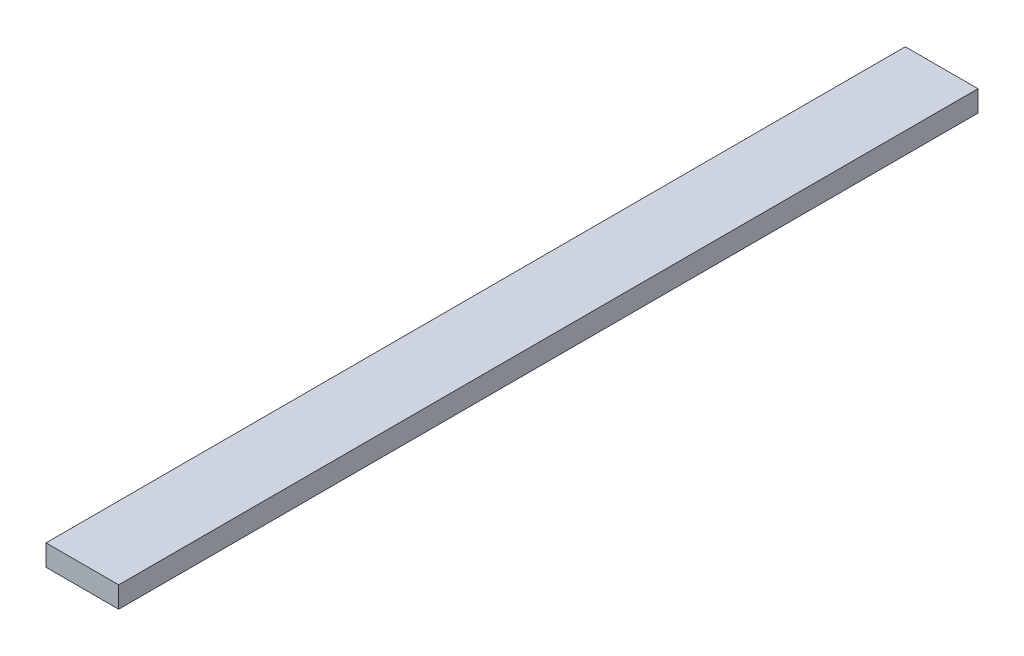
ISO-10303-21;
HEADER;
FILE_DESCRIPTION(('STEP AP214'),'2;1');
FILE_NAME('part.step','',(''),(''),'','','');
FILE_SCHEMA(('AUTOMOTIVE_DESIGN { 1 0 10303 214 1 1 1 1 }'));
ENDSEC;
DATA;
#1=APPLICATION_CONTEXT('core data for automotive mechanical design processes');
#2=APPLICATION_PROTOCOL_DEFINITION('international standard','automotive_design',2000,#1);
#3=PRODUCT_CONTEXT('',#1,'mechanical');
#4=PRODUCT('Part','Part','',(#3));
#5=PRODUCT_RELATED_PRODUCT_CATEGORY('part','',(#4));
#6=PRODUCT_DEFINITION_FORMATION('','',#4);
#7=PRODUCT_DEFINITION_CONTEXT('part definition',#1,'design');
#8=PRODUCT_DEFINITION('design','',#6,#7);
#9=PRODUCT_DEFINITION_SHAPE('','',#8);
#10=(LENGTH_UNIT() NAMED_UNIT(*) SI_UNIT(.MILLI.,.METRE.));
#11=(NAMED_UNIT(*) PLANE_ANGLE_UNIT() SI_UNIT($,.RADIAN.));
#12=(NAMED_UNIT(*) SI_UNIT($,.STERADIAN.) SOLID_ANGLE_UNIT());
#13=UNCERTAINTY_MEASURE_WITH_UNIT(LENGTH_MEASURE(1.E-05),#10,'distance_accuracy_value','');
#14=(GEOMETRIC_REPRESENTATION_CONTEXT(3) GLOBAL_UNCERTAINTY_ASSIGNED_CONTEXT((#13)) GLOBAL_UNIT_ASSIGNED_CONTEXT((#10,
#11,#12)) REPRESENTATION_CONTEXT('',''));
#15=CARTESIAN_POINT('',(0.,0.,0.));
#16=DIRECTION('',(0.,0.,1.));
#17=DIRECTION('',(1.,0.,0.));
#18=AXIS2_PLACEMENT_3D('',#15,#16,#17);
#19=CARTESIAN_POINT('',(-6.14421296296298,4.064,-145.309166666667));
#20=DIRECTION('',(1.,0.,0.));
#21=DIRECTION('',(0.,0.,-1.));
#22=AXIS2_PLACEMENT_3D('',#19,#20,#21);
#23=PLANE('',#22);
#24=DIRECTION('',(0.,0.,1.));
#25=VECTOR('',#24,1.);
#26=CARTESIAN_POINT('',(-6.14421296296298,0.,-145.309166666667));
#27=LINE('',#26,#25);
#28=CARTESIAN_POINT('',(-6.14421296296298,0.,-145.309166666667));
#29=VERTEX_POINT('',#28);
#30=CARTESIAN_POINT('',(-6.14421296296296,0.,19.7908333333333));
#31=VERTEX_POINT('',#30);
#32=EDGE_CURVE('E96',#29,#31,#27,.T.);
#33=ORIENTED_EDGE('',*,*,#32,.T.);
#34=DIRECTION('',(0.,-1.,0.));
#35=VECTOR('',#34,1.);
#36=CARTESIAN_POINT('',(-6.14421296296296,4.064,19.7908333333333));
#37=LINE('',#36,#35);
#38=CARTESIAN_POINT('',(-6.14421296296296,4.064,19.7908333333333));
#39=VERTEX_POINT('',#38);
#40=EDGE_CURVE('E11',#39,#31,#37,.T.);
#41=ORIENTED_EDGE('',*,*,#40,.F.);
#42=DIRECTION('',(0.,0.,1.));
#43=VECTOR('',#42,1.);
#44=CARTESIAN_POINT('',(-6.14421296296298,4.064,-145.309166666667));
#45=LINE('',#44,#43);
#46=CARTESIAN_POINT('',(-6.14421296296298,4.064,-145.309166666667));
#47=VERTEX_POINT('',#46);
#48=EDGE_CURVE('E84',#47,#39,#45,.T.);
#49=ORIENTED_EDGE('',*,*,#48,.F.);
#50=DIRECTION('',(0.,-1.,0.));
#51=VECTOR('',#50,1.);
#52=CARTESIAN_POINT('',(-6.14421296296298,4.064,-145.309166666667));
#53=LINE('',#52,#51);
#54=EDGE_CURVE('E92',#47,#29,#53,.T.);
#55=ORIENTED_EDGE('',*,*,#54,.T.);
#56=EDGE_LOOP('',(#33,#41,#49,#55));
#57=FACE_BOUND('',#56,.T.);
#58=ADVANCED_FACE('F33',(#57),#23,.F.);
#59=CARTESIAN_POINT('',(-6.14421296296296,4.064,19.7908333333333));
#60=DIRECTION('',(0.,0.,-1.));
#61=DIRECTION('',(-1.,0.,0.));
#62=AXIS2_PLACEMENT_3D('',#59,#60,#61);
#63=PLANE('',#62);
#64=DIRECTION('',(1.,0.,0.));
#65=VECTOR('',#64,1.);
#66=CARTESIAN_POINT('',(-6.14421296296296,0.,19.7908333333333));
#67=LINE('',#66,#65);
#68=CARTESIAN_POINT('',(7.82578703703704,0.,19.7908333333333));
#69=VERTEX_POINT('',#68);
#70=EDGE_CURVE('E88',#31,#69,#67,.T.);
#71=ORIENTED_EDGE('',*,*,#70,.T.);
#72=DIRECTION('',(0.,-1.,0.));
#73=VECTOR('',#72,1.);
#74=CARTESIAN_POINT('',(7.82578703703704,4.064,19.7908333333333));
#75=LINE('',#74,#73);
#76=CARTESIAN_POINT('',(7.82578703703704,4.064,19.7908333333333));
#77=VERTEX_POINT('',#76);
#78=EDGE_CURVE('E41',#77,#69,#75,.T.);
#79=ORIENTED_EDGE('',*,*,#78,.F.);
#80=DIRECTION('',(1.,0.,0.));
#81=VECTOR('',#80,1.);
#82=CARTESIAN_POINT('',(-6.14421296296296,4.064,19.7908333333333));
#83=LINE('',#82,#81);
#84=EDGE_CURVE('E79',#39,#77,#83,.T.);
#85=ORIENTED_EDGE('',*,*,#84,.F.);
#86=ORIENTED_EDGE('',*,*,#40,.T.);
#87=EDGE_LOOP('',(#71,#79,#85,#86));
#88=FACE_BOUND('',#87,.T.);
#89=ADVANCED_FACE('F87',(#88),#63,.F.);
#90=CARTESIAN_POINT('',(7.82578703703702,4.064,-145.309166666667));
#91=DIRECTION('',(-1.,0.,0.));
#92=DIRECTION('',(0.,0.,1.));
#93=AXIS2_PLACEMENT_3D('',#90,#91,#92);
#94=PLANE('',#93);
#95=DIRECTION('',(0.,0.,-1.));
#96=VECTOR('',#95,1.);
#97=CARTESIAN_POINT('',(7.82578703703702,0.,-145.309166666667));
#98=LINE('',#97,#96);
#99=CARTESIAN_POINT('',(7.82578703703702,0.,-145.309166666667));
#100=VERTEX_POINT('',#99);
#101=EDGE_CURVE('E66',#69,#100,#98,.T.);
#102=ORIENTED_EDGE('',*,*,#101,.T.);
#103=DIRECTION('',(0.,-1.,0.));
#104=VECTOR('',#103,1.);
#105=CARTESIAN_POINT('',(7.82578703703702,4.064,-145.309166666667));
#106=LINE('',#105,#104);
#107=CARTESIAN_POINT('',(7.82578703703702,4.064,-145.309166666667));
#108=VERTEX_POINT('',#107);
#109=EDGE_CURVE('E89',#108,#100,#106,.T.);
#110=ORIENTED_EDGE('',*,*,#109,.F.);
#111=DIRECTION('',(0.,0.,-1.));
#112=VECTOR('',#111,1.);
#113=CARTESIAN_POINT('',(7.82578703703702,4.064,-145.309166666667));
#114=LINE('',#113,#112);
#115=EDGE_CURVE('E82',#77,#108,#114,.T.);
#116=ORIENTED_EDGE('',*,*,#115,.F.);
#117=ORIENTED_EDGE('',*,*,#78,.T.);
#118=EDGE_LOOP('',(#102,#110,#116,#117));
#119=FACE_BOUND('',#118,.T.);
#120=ADVANCED_FACE('F90',(#119),#94,.F.);
#121=CARTESIAN_POINT('',(-6.14421296296298,4.064,-145.309166666667));
#122=DIRECTION('',(0.,0.,1.));
#123=DIRECTION('',(1.,0.,0.));
#124=AXIS2_PLACEMENT_3D('',#121,#122,#123);
#125=PLANE('',#124);
#126=DIRECTION('',(-1.,0.,0.));
#127=VECTOR('',#126,1.);
#128=CARTESIAN_POINT('',(-6.14421296296298,0.,-145.309166666667));
#129=LINE('',#128,#127);
#130=EDGE_CURVE('E72',#100,#29,#129,.T.);
#131=ORIENTED_EDGE('',*,*,#130,.T.);
#132=ORIENTED_EDGE('',*,*,#54,.F.);
#133=DIRECTION('',(-1.,0.,0.));
#134=VECTOR('',#133,1.);
#135=CARTESIAN_POINT('',(-6.14421296296298,4.064,-145.309166666667));
#136=LINE('',#135,#134);
#137=EDGE_CURVE('E49',#108,#47,#136,.T.);
#138=ORIENTED_EDGE('',*,*,#137,.F.);
#139=ORIENTED_EDGE('',*,*,#109,.T.);
#140=EDGE_LOOP('',(#131,#132,#138,#139));
#141=FACE_BOUND('',#140,.T.);
#142=ADVANCED_FACE('F103',(#141),#125,.F.);
#143=CARTESIAN_POINT('',(0.,4.064,0.));
#144=DIRECTION('',(0.,1.,0.));
#145=DIRECTION('',(0.,0.,1.));
#146=AXIS2_PLACEMENT_3D('',#143,#144,#145);
#147=PLANE('',#146);
#148=ORIENTED_EDGE('',*,*,#48,.T.);
#149=ORIENTED_EDGE('',*,*,#84,.T.);
#150=ORIENTED_EDGE('',*,*,#115,.T.);
#151=ORIENTED_EDGE('',*,*,#137,.T.);
#152=EDGE_LOOP('',(#148,#149,#150,#151));
#153=FACE_BOUND('',#152,.T.);
#154=ADVANCED_FACE('F80',(#153),#147,.T.);
#155=CARTESIAN_POINT('',(0.,0.,0.));
#156=DIRECTION('',(0.,1.,0.));
#157=DIRECTION('',(0.,0.,1.));
#158=AXIS2_PLACEMENT_3D('',#155,#156,#157);
#159=PLANE('',#158);
#160=ORIENTED_EDGE('',*,*,#32,.F.);
#161=ORIENTED_EDGE('',*,*,#130,.F.);
#162=ORIENTED_EDGE('',*,*,#101,.F.);
#163=ORIENTED_EDGE('',*,*,#70,.F.);
#164=EDGE_LOOP('',(#160,#161,#162,#163));
#165=FACE_BOUND('',#164,.T.);
#166=ADVANCED_FACE('F106',(#165),#159,.F.);
#167=CLOSED_SHELL('',(#58,#89,#120,#142,#154,#166));
#168=MANIFOLD_SOLID_BREP('B2',#167);
#169=ADVANCED_BREP_SHAPE_REPRESENTATION('',(#18,#168),#14);
#170=SHAPE_DEFINITION_REPRESENTATION(#9,#169);
ENDSEC;
END-ISO-10303-21;
